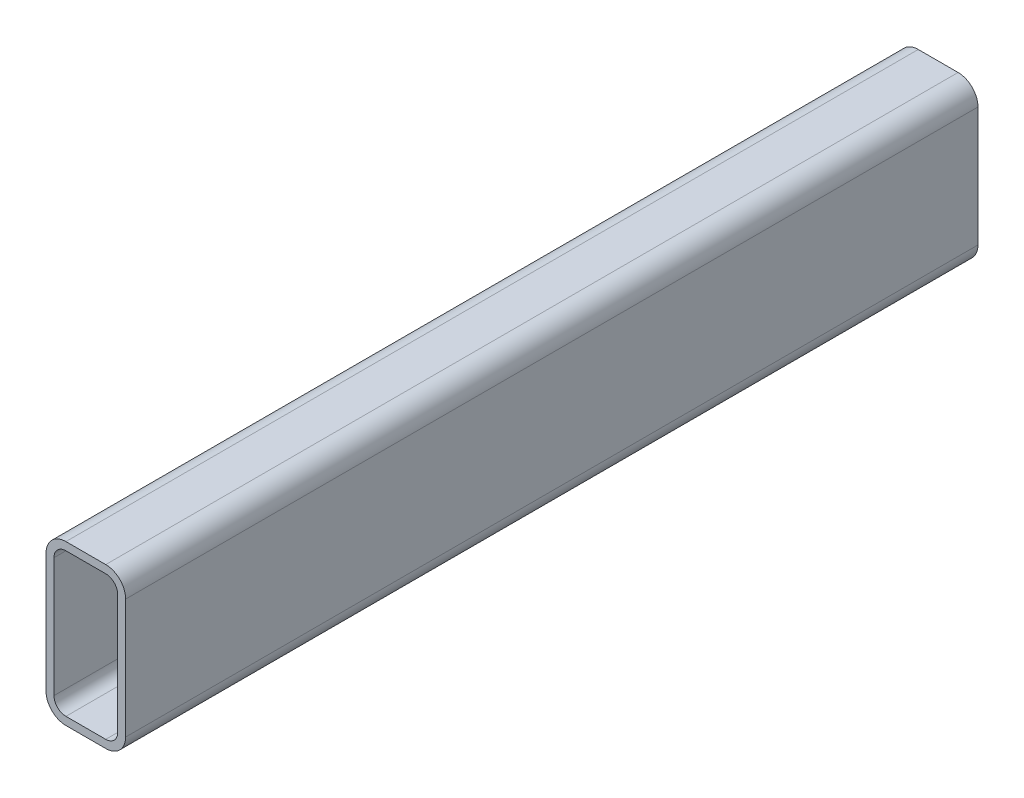
ISO-10303-21;
HEADER;
FILE_DESCRIPTION(('STEP AP214'),'2;1');
FILE_NAME('part.step','',(''),(''),'','','');
FILE_SCHEMA(('AUTOMOTIVE_DESIGN { 1 0 10303 214 1 1 1 1 }'));
ENDSEC;
DATA;
#1=APPLICATION_CONTEXT('core data for automotive mechanical design processes');
#2=APPLICATION_PROTOCOL_DEFINITION('international standard','automotive_design',2000,#1);
#3=PRODUCT_CONTEXT('',#1,'mechanical');
#4=PRODUCT('Part','Part','',(#3));
#5=PRODUCT_RELATED_PRODUCT_CATEGORY('part','',(#4));
#6=PRODUCT_DEFINITION_FORMATION('','',#4);
#7=PRODUCT_DEFINITION_CONTEXT('part definition',#1,'design');
#8=PRODUCT_DEFINITION('design','',#6,#7);
#9=PRODUCT_DEFINITION_SHAPE('','',#8);
#10=(LENGTH_UNIT() NAMED_UNIT(*) SI_UNIT(.MILLI.,.METRE.));
#11=(NAMED_UNIT(*) PLANE_ANGLE_UNIT() SI_UNIT($,.RADIAN.));
#12=(NAMED_UNIT(*) SI_UNIT($,.STERADIAN.) SOLID_ANGLE_UNIT());
#13=UNCERTAINTY_MEASURE_WITH_UNIT(LENGTH_MEASURE(1.E-05),#10,'distance_accuracy_value','');
#14=(GEOMETRIC_REPRESENTATION_CONTEXT(3) GLOBAL_UNCERTAINTY_ASSIGNED_CONTEXT((#13)) GLOBAL_UNIT_ASSIGNED_CONTEXT((#10,
#11,#12)) REPRESENTATION_CONTEXT('',''));
#15=CARTESIAN_POINT('',(0.,0.,0.));
#16=DIRECTION('',(0.,0.,1.));
#17=DIRECTION('',(1.,0.,0.));
#18=AXIS2_PLACEMENT_3D('',#15,#16,#17);
#19=CARTESIAN_POINT('',(-20.,-60.,428.));
#20=DIRECTION('',(0.,0.,1.));
#21=DIRECTION('',(1.,0.,0.));
#22=AXIS2_PLACEMENT_3D('',#19,#20,#21);
#23=PLANE('',#22);
#24=CARTESIAN_POINT('',(-20.,-60.,428.));
#25=DIRECTION('',(0.,0.,1.));
#26=DIRECTION('',(1.,0.,0.));
#27=AXIS2_PLACEMENT_3D('',#24,#25,#26);
#28=CIRCLE('',#27,20.);
#29=CARTESIAN_POINT('',(-40.,-60.,428.));
#30=VERTEX_POINT('',#29);
#31=CARTESIAN_POINT('',(-20.,-80.,428.));
#32=VERTEX_POINT('',#31);
#33=EDGE_CURVE('E212',#30,#32,#28,.T.);
#34=ORIENTED_EDGE('',*,*,#33,.T.);
#35=DIRECTION('',(1.,0.,0.));
#36=VECTOR('',#35,1.);
#37=CARTESIAN_POINT('',(-20.,-80.,428.));
#38=LINE('',#37,#36);
#39=CARTESIAN_POINT('',(20.,-80.,428.));
#40=VERTEX_POINT('',#39);
#41=EDGE_CURVE('E215',#32,#40,#38,.T.);
#42=ORIENTED_EDGE('',*,*,#41,.T.);
#43=CARTESIAN_POINT('',(20.,-60.,428.));
#44=DIRECTION('',(0.,0.,1.));
#45=DIRECTION('',(1.,0.,0.));
#46=AXIS2_PLACEMENT_3D('',#43,#44,#45);
#47=CIRCLE('',#46,20.);
#48=CARTESIAN_POINT('',(40.,-60.,428.));
#49=VERTEX_POINT('',#48);
#50=EDGE_CURVE('E218',#40,#49,#47,.T.);
#51=ORIENTED_EDGE('',*,*,#50,.T.);
#52=DIRECTION('',(0.,1.,0.));
#53=VECTOR('',#52,1.);
#54=CARTESIAN_POINT('',(40.,60.,428.));
#55=LINE('',#54,#53);
#56=CARTESIAN_POINT('',(40.,60.,428.));
#57=VERTEX_POINT('',#56);
#58=EDGE_CURVE('E220',#49,#57,#55,.T.);
#59=ORIENTED_EDGE('',*,*,#58,.T.);
#60=CARTESIAN_POINT('',(20.,60.,428.));
#61=DIRECTION('',(0.,0.,1.));
#62=DIRECTION('',(-1.,0.,0.));
#63=AXIS2_PLACEMENT_3D('',#60,#61,#62);
#64=CIRCLE('',#63,20.);
#65=CARTESIAN_POINT('',(20.,80.,428.));
#66=VERTEX_POINT('',#65);
#67=EDGE_CURVE('E222',#57,#66,#64,.T.);
#68=ORIENTED_EDGE('',*,*,#67,.T.);
#69=DIRECTION('',(-1.,0.,0.));
#70=VECTOR('',#69,1.);
#71=CARTESIAN_POINT('',(-20.,80.,428.));
#72=LINE('',#71,#70);
#73=CARTESIAN_POINT('',(-20.,80.,428.));
#74=VERTEX_POINT('',#73);
#75=EDGE_CURVE('E224',#66,#74,#72,.T.);
#76=ORIENTED_EDGE('',*,*,#75,.T.);
#77=CARTESIAN_POINT('',(-20.,60.,428.));
#78=DIRECTION('',(0.,0.,1.));
#79=DIRECTION('',(1.,0.,0.));
#80=AXIS2_PLACEMENT_3D('',#77,#78,#79);
#81=CIRCLE('',#80,20.);
#82=CARTESIAN_POINT('',(-40.,60.,428.));
#83=VERTEX_POINT('',#82);
#84=EDGE_CURVE('E226',#74,#83,#81,.T.);
#85=ORIENTED_EDGE('',*,*,#84,.T.);
#86=DIRECTION('',(0.,-1.,0.));
#87=VECTOR('',#86,1.);
#88=CARTESIAN_POINT('',(-40.,60.,428.));
#89=LINE('',#88,#87);
#90=EDGE_CURVE('E228',#83,#30,#89,.T.);
#91=ORIENTED_EDGE('',*,*,#90,.T.);
#92=EDGE_LOOP('',(#34,#42,#51,#59,#68,#76,#85,#91));
#93=FACE_BOUND('',#92,.T.);
#94=DIRECTION('',(1.,0.,0.));
#95=VECTOR('',#94,1.);
#96=CARTESIAN_POINT('',(-20.,-72.,428.));
#97=LINE('',#96,#95);
#98=CARTESIAN_POINT('',(-20.,-72.,428.));
#99=VERTEX_POINT('',#98);
#100=CARTESIAN_POINT('',(20.,-72.,428.));
#101=VERTEX_POINT('',#100);
#102=EDGE_CURVE('E155',#99,#101,#97,.T.);
#103=ORIENTED_EDGE('',*,*,#102,.F.);
#104=CARTESIAN_POINT('',(-20.,-60.,428.));
#105=DIRECTION('',(0.,0.,1.));
#106=DIRECTION('',(-1.,0.,0.));
#107=AXIS2_PLACEMENT_3D('',#104,#105,#106);
#108=CIRCLE('',#107,12.);
#109=CARTESIAN_POINT('',(-32.,-60.,428.));
#110=VERTEX_POINT('',#109);
#111=EDGE_CURVE('E147',#110,#99,#108,.T.);
#112=ORIENTED_EDGE('',*,*,#111,.F.);
#113=DIRECTION('',(0.,-1.,0.));
#114=VECTOR('',#113,1.);
#115=CARTESIAN_POINT('',(-32.,60.,428.));
#116=LINE('',#115,#114);
#117=CARTESIAN_POINT('',(-32.,60.,428.));
#118=VERTEX_POINT('',#117);
#119=EDGE_CURVE('E180',#118,#110,#116,.T.);
#120=ORIENTED_EDGE('',*,*,#119,.F.);
#121=CARTESIAN_POINT('',(-20.,60.,428.));
#122=DIRECTION('',(0.,0.,1.));
#123=DIRECTION('',(1.,0.,0.));
#124=AXIS2_PLACEMENT_3D('',#121,#122,#123);
#125=CIRCLE('',#124,12.);
#126=CARTESIAN_POINT('',(-20.,72.,428.));
#127=VERTEX_POINT('',#126);
#128=EDGE_CURVE('E178',#127,#118,#125,.T.);
#129=ORIENTED_EDGE('',*,*,#128,.F.);
#130=DIRECTION('',(-1.,0.,0.));
#131=VECTOR('',#130,1.);
#132=CARTESIAN_POINT('',(-20.,72.,428.));
#133=LINE('',#132,#131);
#134=CARTESIAN_POINT('',(20.,72.,428.));
#135=VERTEX_POINT('',#134);
#136=EDGE_CURVE('E176',#135,#127,#133,.T.);
#137=ORIENTED_EDGE('',*,*,#136,.F.);
#138=CARTESIAN_POINT('',(20.,60.,428.));
#139=DIRECTION('',(0.,0.,1.));
#140=DIRECTION('',(-1.,0.,0.));
#141=AXIS2_PLACEMENT_3D('',#138,#139,#140);
#142=CIRCLE('',#141,12.);
#143=CARTESIAN_POINT('',(32.,60.,428.));
#144=VERTEX_POINT('',#143);
#145=EDGE_CURVE('E174',#144,#135,#142,.T.);
#146=ORIENTED_EDGE('',*,*,#145,.F.);
#147=DIRECTION('',(0.,1.,0.));
#148=VECTOR('',#147,1.);
#149=CARTESIAN_POINT('',(32.,60.,428.));
#150=LINE('',#149,#148);
#151=CARTESIAN_POINT('',(32.,-60.,428.));
#152=VERTEX_POINT('',#151);
#153=EDGE_CURVE('E170',#152,#144,#150,.T.);
#154=ORIENTED_EDGE('',*,*,#153,.F.);
#155=CARTESIAN_POINT('',(20.,-60.,428.));
#156=DIRECTION('',(0.,0.,1.));
#157=DIRECTION('',(-1.,0.,0.));
#158=AXIS2_PLACEMENT_3D('',#155,#156,#157);
#159=CIRCLE('',#158,12.);
#160=EDGE_CURVE('E168',#101,#152,#159,.T.);
#161=ORIENTED_EDGE('',*,*,#160,.F.);
#162=EDGE_LOOP('',(#103,#112,#120,#129,#137,#146,#154,#161));
#163=FACE_BOUND('',#162,.T.);
#164=ADVANCED_FACE('F34',(#93,#163),#23,.T.);
#165=CARTESIAN_POINT('',(-20.,-60.,-428.));
#166=DIRECTION('',(0.,0.,1.));
#167=DIRECTION('',(1.,0.,0.));
#168=AXIS2_PLACEMENT_3D('',#165,#166,#167);
#169=PLANE('',#168);
#170=CARTESIAN_POINT('',(-20.,-60.,-428.));
#171=DIRECTION('',(0.,0.,1.));
#172=DIRECTION('',(1.,0.,0.));
#173=AXIS2_PLACEMENT_3D('',#170,#171,#172);
#174=CIRCLE('',#173,20.);
#175=CARTESIAN_POINT('',(-40.,-60.,-428.));
#176=VERTEX_POINT('',#175);
#177=CARTESIAN_POINT('',(-20.,-80.,-428.));
#178=VERTEX_POINT('',#177);
#179=EDGE_CURVE('E163',#176,#178,#174,.T.);
#180=ORIENTED_EDGE('',*,*,#179,.F.);
#181=DIRECTION('',(0.,-1.,0.));
#182=VECTOR('',#181,1.);
#183=CARTESIAN_POINT('',(-40.,60.,-428.));
#184=LINE('',#183,#182);
#185=CARTESIAN_POINT('',(-40.,60.,-428.));
#186=VERTEX_POINT('',#185);
#187=EDGE_CURVE('E216',#186,#176,#184,.T.);
#188=ORIENTED_EDGE('',*,*,#187,.F.);
#189=CARTESIAN_POINT('',(-20.,60.,-428.));
#190=DIRECTION('',(0.,0.,1.));
#191=DIRECTION('',(1.,0.,0.));
#192=AXIS2_PLACEMENT_3D('',#189,#190,#191);
#193=CIRCLE('',#192,20.);
#194=CARTESIAN_POINT('',(-20.,80.,-428.));
#195=VERTEX_POINT('',#194);
#196=EDGE_CURVE('E243',#195,#186,#193,.T.);
#197=ORIENTED_EDGE('',*,*,#196,.F.);
#198=DIRECTION('',(-1.,0.,0.));
#199=VECTOR('',#198,1.);
#200=CARTESIAN_POINT('',(-20.,80.,-428.));
#201=LINE('',#200,#199);
#202=CARTESIAN_POINT('',(20.,80.,-428.));
#203=VERTEX_POINT('',#202);
#204=EDGE_CURVE('E241',#203,#195,#201,.T.);
#205=ORIENTED_EDGE('',*,*,#204,.F.);
#206=CARTESIAN_POINT('',(20.,60.,-428.));
#207=DIRECTION('',(0.,0.,1.));
#208=DIRECTION('',(-1.,0.,0.));
#209=AXIS2_PLACEMENT_3D('',#206,#207,#208);
#210=CIRCLE('',#209,20.);
#211=CARTESIAN_POINT('',(40.,60.,-428.));
#212=VERTEX_POINT('',#211);
#213=EDGE_CURVE('E239',#212,#203,#210,.T.);
#214=ORIENTED_EDGE('',*,*,#213,.F.);
#215=DIRECTION('',(0.,1.,0.));
#216=VECTOR('',#215,1.);
#217=CARTESIAN_POINT('',(40.,60.,-428.));
#218=LINE('',#217,#216);
#219=CARTESIAN_POINT('',(40.,-60.,-428.));
#220=VERTEX_POINT('',#219);
#221=EDGE_CURVE('E237',#220,#212,#218,.T.);
#222=ORIENTED_EDGE('',*,*,#221,.F.);
#223=CARTESIAN_POINT('',(20.,-60.,-428.));
#224=DIRECTION('',(0.,0.,1.));
#225=DIRECTION('',(1.,0.,0.));
#226=AXIS2_PLACEMENT_3D('',#223,#224,#225);
#227=CIRCLE('',#226,20.);
#228=CARTESIAN_POINT('',(20.,-80.,-428.));
#229=VERTEX_POINT('',#228);
#230=EDGE_CURVE('E235',#229,#220,#227,.T.);
#231=ORIENTED_EDGE('',*,*,#230,.F.);
#232=DIRECTION('',(1.,0.,0.));
#233=VECTOR('',#232,1.);
#234=CARTESIAN_POINT('',(-20.,-80.,-428.));
#235=LINE('',#234,#233);
#236=EDGE_CURVE('E233',#178,#229,#235,.T.);
#237=ORIENTED_EDGE('',*,*,#236,.F.);
#238=EDGE_LOOP('',(#180,#188,#197,#205,#214,#222,#231,#237));
#239=FACE_BOUND('',#238,.T.);
#240=CARTESIAN_POINT('',(-20.,-60.,-428.));
#241=DIRECTION('',(0.,0.,1.));
#242=DIRECTION('',(-1.,0.,0.));
#243=AXIS2_PLACEMENT_3D('',#240,#241,#242);
#244=CIRCLE('',#243,12.);
#245=CARTESIAN_POINT('',(-32.,-60.,-428.));
#246=VERTEX_POINT('',#245);
#247=CARTESIAN_POINT('',(-20.,-72.,-428.));
#248=VERTEX_POINT('',#247);
#249=EDGE_CURVE('E57',#246,#248,#244,.T.);
#250=ORIENTED_EDGE('',*,*,#249,.T.);
#251=DIRECTION('',(1.,0.,0.));
#252=VECTOR('',#251,1.);
#253=CARTESIAN_POINT('',(-20.,-72.,-428.));
#254=LINE('',#253,#252);
#255=CARTESIAN_POINT('',(20.,-72.,-428.));
#256=VERTEX_POINT('',#255);
#257=EDGE_CURVE('E162',#248,#256,#254,.T.);
#258=ORIENTED_EDGE('',*,*,#257,.T.);
#259=CARTESIAN_POINT('',(20.,-60.,-428.));
#260=DIRECTION('',(0.,0.,1.));
#261=DIRECTION('',(-1.,0.,0.));
#262=AXIS2_PLACEMENT_3D('',#259,#260,#261);
#263=CIRCLE('',#262,12.);
#264=CARTESIAN_POINT('',(32.,-60.,-428.));
#265=VERTEX_POINT('',#264);
#266=EDGE_CURVE('E184',#256,#265,#263,.T.);
#267=ORIENTED_EDGE('',*,*,#266,.T.);
#268=DIRECTION('',(0.,1.,0.));
#269=VECTOR('',#268,1.);
#270=CARTESIAN_POINT('',(32.,60.,-428.));
#271=LINE('',#270,#269);
#272=CARTESIAN_POINT('',(32.,60.,-428.));
#273=VERTEX_POINT('',#272);
#274=EDGE_CURVE('E187',#265,#273,#271,.T.);
#275=ORIENTED_EDGE('',*,*,#274,.T.);
#276=CARTESIAN_POINT('',(20.,60.,-428.));
#277=DIRECTION('',(0.,0.,1.));
#278=DIRECTION('',(-1.,0.,0.));
#279=AXIS2_PLACEMENT_3D('',#276,#277,#278);
#280=CIRCLE('',#279,12.);
#281=CARTESIAN_POINT('',(20.,72.,-428.));
#282=VERTEX_POINT('',#281);
#283=EDGE_CURVE('E190',#273,#282,#280,.T.);
#284=ORIENTED_EDGE('',*,*,#283,.T.);
#285=DIRECTION('',(-1.,0.,0.));
#286=VECTOR('',#285,1.);
#287=CARTESIAN_POINT('',(-20.,72.,-428.));
#288=LINE('',#287,#286);
#289=CARTESIAN_POINT('',(-20.,72.,-428.));
#290=VERTEX_POINT('',#289);
#291=EDGE_CURVE('E193',#282,#290,#288,.T.);
#292=ORIENTED_EDGE('',*,*,#291,.T.);
#293=CARTESIAN_POINT('',(-20.,60.,-428.));
#294=DIRECTION('',(0.,0.,1.));
#295=DIRECTION('',(1.,0.,0.));
#296=AXIS2_PLACEMENT_3D('',#293,#294,#295);
#297=CIRCLE('',#296,12.);
#298=CARTESIAN_POINT('',(-32.,60.,-428.));
#299=VERTEX_POINT('',#298);
#300=EDGE_CURVE('E196',#290,#299,#297,.T.);
#301=ORIENTED_EDGE('',*,*,#300,.T.);
#302=DIRECTION('',(0.,-1.,0.));
#303=VECTOR('',#302,1.);
#304=CARTESIAN_POINT('',(-32.,60.,-428.));
#305=LINE('',#304,#303);
#306=EDGE_CURVE('E156',#299,#246,#305,.T.);
#307=ORIENTED_EDGE('',*,*,#306,.T.);
#308=EDGE_LOOP('',(#250,#258,#267,#275,#284,#292,#301,#307));
#309=FACE_BOUND('',#308,.T.);
#310=ADVANCED_FACE('F273',(#239,#309),#169,.F.);
#311=CARTESIAN_POINT('',(-20.,-60.,428.));
#312=DIRECTION('',(0.,0.,-1.));
#313=DIRECTION('',(-1.,0.,0.));
#314=AXIS2_PLACEMENT_3D('',#311,#312,#313);
#315=CYLINDRICAL_SURFACE('',#314,20.);
#316=ORIENTED_EDGE('',*,*,#179,.T.);
#317=DIRECTION('',(0.,0.,-1.));
#318=VECTOR('',#317,1.);
#319=CARTESIAN_POINT('',(-20.,-80.,428.));
#320=LINE('',#319,#318);
#321=EDGE_CURVE('E11',#32,#178,#320,.T.);
#322=ORIENTED_EDGE('',*,*,#321,.F.);
#323=ORIENTED_EDGE('',*,*,#33,.F.);
#324=DIRECTION('',(0.,0.,-1.));
#325=VECTOR('',#324,1.);
#326=CARTESIAN_POINT('',(-40.,-60.,428.));
#327=LINE('',#326,#325);
#328=EDGE_CURVE('E230',#30,#176,#327,.T.);
#329=ORIENTED_EDGE('',*,*,#328,.T.);
#330=EDGE_LOOP('',(#316,#322,#323,#329));
#331=FACE_BOUND('',#330,.T.);
#332=ADVANCED_FACE('F36',(#331),#315,.T.);
#333=CARTESIAN_POINT('',(-20.,-80.,428.));
#334=DIRECTION('',(0.,1.,0.));
#335=DIRECTION('',(0.,0.,1.));
#336=AXIS2_PLACEMENT_3D('',#333,#334,#335);
#337=PLANE('',#336);
#338=ORIENTED_EDGE('',*,*,#236,.T.);
#339=DIRECTION('',(0.,0.,-1.));
#340=VECTOR('',#339,1.);
#341=CARTESIAN_POINT('',(20.,-80.,428.));
#342=LINE('',#341,#340);
#343=EDGE_CURVE('E42',#40,#229,#342,.T.);
#344=ORIENTED_EDGE('',*,*,#343,.F.);
#345=ORIENTED_EDGE('',*,*,#41,.F.);
#346=ORIENTED_EDGE('',*,*,#321,.T.);
#347=EDGE_LOOP('',(#338,#344,#345,#346));
#348=FACE_BOUND('',#347,.T.);
#349=ADVANCED_FACE('F290',(#348),#337,.F.);
#350=CARTESIAN_POINT('',(20.,-60.,428.));
#351=DIRECTION('',(0.,0.,-1.));
#352=DIRECTION('',(-1.,0.,0.));
#353=AXIS2_PLACEMENT_3D('',#350,#351,#352);
#354=CYLINDRICAL_SURFACE('',#353,20.);
#355=ORIENTED_EDGE('',*,*,#230,.T.);
#356=DIRECTION('',(0.,0.,-1.));
#357=VECTOR('',#356,1.);
#358=CARTESIAN_POINT('',(40.,-60.,428.));
#359=LINE('',#358,#357);
#360=EDGE_CURVE('E260',#49,#220,#359,.T.);
#361=ORIENTED_EDGE('',*,*,#360,.F.);
#362=ORIENTED_EDGE('',*,*,#50,.F.);
#363=ORIENTED_EDGE('',*,*,#343,.T.);
#364=EDGE_LOOP('',(#355,#361,#362,#363));
#365=FACE_BOUND('',#364,.T.);
#366=ADVANCED_FACE('F267',(#365),#354,.T.);
#367=CARTESIAN_POINT('',(40.,60.,428.));
#368=DIRECTION('',(-1.,0.,0.));
#369=DIRECTION('',(0.,0.,1.));
#370=AXIS2_PLACEMENT_3D('',#367,#368,#369);
#371=PLANE('',#370);
#372=ORIENTED_EDGE('',*,*,#221,.T.);
#373=DIRECTION('',(0.,0.,-1.));
#374=VECTOR('',#373,1.);
#375=CARTESIAN_POINT('',(40.,60.,428.));
#376=LINE('',#375,#374);
#377=EDGE_CURVE('E257',#57,#212,#376,.T.);
#378=ORIENTED_EDGE('',*,*,#377,.F.);
#379=ORIENTED_EDGE('',*,*,#58,.F.);
#380=ORIENTED_EDGE('',*,*,#360,.T.);
#381=EDGE_LOOP('',(#372,#378,#379,#380));
#382=FACE_BOUND('',#381,.T.);
#383=ADVANCED_FACE('F279',(#382),#371,.F.);
#384=CARTESIAN_POINT('',(20.,60.,428.));
#385=DIRECTION('',(0.,0.,-1.));
#386=DIRECTION('',(-1.,0.,0.));
#387=AXIS2_PLACEMENT_3D('',#384,#385,#386);
#388=CYLINDRICAL_SURFACE('',#387,20.);
#389=ORIENTED_EDGE('',*,*,#213,.T.);
#390=DIRECTION('',(0.,0.,-1.));
#391=VECTOR('',#390,1.);
#392=CARTESIAN_POINT('',(20.,80.,428.));
#393=LINE('',#392,#391);
#394=EDGE_CURVE('E254',#66,#203,#393,.T.);
#395=ORIENTED_EDGE('',*,*,#394,.F.);
#396=ORIENTED_EDGE('',*,*,#67,.F.);
#397=ORIENTED_EDGE('',*,*,#377,.T.);
#398=EDGE_LOOP('',(#389,#395,#396,#397));
#399=FACE_BOUND('',#398,.T.);
#400=ADVANCED_FACE('F283',(#399),#388,.T.);
#401=CARTESIAN_POINT('',(-20.,80.,428.));
#402=DIRECTION('',(0.,-1.,0.));
#403=DIRECTION('',(0.,0.,-1.));
#404=AXIS2_PLACEMENT_3D('',#401,#402,#403);
#405=PLANE('',#404);
#406=ORIENTED_EDGE('',*,*,#204,.T.);
#407=DIRECTION('',(0.,0.,-1.));
#408=VECTOR('',#407,1.);
#409=CARTESIAN_POINT('',(-20.,80.,428.));
#410=LINE('',#409,#408);
#411=EDGE_CURVE('E251',#74,#195,#410,.T.);
#412=ORIENTED_EDGE('',*,*,#411,.F.);
#413=ORIENTED_EDGE('',*,*,#75,.F.);
#414=ORIENTED_EDGE('',*,*,#394,.T.);
#415=EDGE_LOOP('',(#406,#412,#413,#414));
#416=FACE_BOUND('',#415,.T.);
#417=ADVANCED_FACE('F303',(#416),#405,.F.);
#418=CARTESIAN_POINT('',(-20.,60.,428.));
#419=DIRECTION('',(0.,0.,-1.));
#420=DIRECTION('',(-1.,0.,0.));
#421=AXIS2_PLACEMENT_3D('',#418,#419,#420);
#422=CYLINDRICAL_SURFACE('',#421,20.);
#423=ORIENTED_EDGE('',*,*,#196,.T.);
#424=DIRECTION('',(0.,0.,-1.));
#425=VECTOR('',#424,1.);
#426=CARTESIAN_POINT('',(-40.,60.,428.));
#427=LINE('',#426,#425);
#428=EDGE_CURVE('E248',#83,#186,#427,.T.);
#429=ORIENTED_EDGE('',*,*,#428,.F.);
#430=ORIENTED_EDGE('',*,*,#84,.F.);
#431=ORIENTED_EDGE('',*,*,#411,.T.);
#432=EDGE_LOOP('',(#423,#429,#430,#431));
#433=FACE_BOUND('',#432,.T.);
#434=ADVANCED_FACE('F301',(#433),#422,.T.);
#435=CARTESIAN_POINT('',(-40.,60.,428.));
#436=DIRECTION('',(1.,0.,0.));
#437=DIRECTION('',(0.,1.,0.));
#438=AXIS2_PLACEMENT_3D('',#435,#436,#437);
#439=PLANE('',#438);
#440=ORIENTED_EDGE('',*,*,#187,.T.);
#441=ORIENTED_EDGE('',*,*,#328,.F.);
#442=ORIENTED_EDGE('',*,*,#90,.F.);
#443=ORIENTED_EDGE('',*,*,#428,.T.);
#444=EDGE_LOOP('',(#440,#441,#442,#443));
#445=FACE_BOUND('',#444,.T.);
#446=ADVANCED_FACE('F296',(#445),#439,.F.);
#447=CARTESIAN_POINT('',(-20.,-60.,428.));
#448=DIRECTION('',(0.,0.,-1.));
#449=DIRECTION('',(-1.,0.,0.));
#450=AXIS2_PLACEMENT_3D('',#447,#448,#449);
#451=CYLINDRICAL_SURFACE('',#450,12.);
#452=ORIENTED_EDGE('',*,*,#249,.F.);
#453=DIRECTION('',(0.,0.,-1.));
#454=VECTOR('',#453,1.);
#455=CARTESIAN_POINT('',(-32.,-60.,428.));
#456=LINE('',#455,#454);
#457=EDGE_CURVE('E151',#110,#246,#456,.T.);
#458=ORIENTED_EDGE('',*,*,#457,.F.);
#459=ORIENTED_EDGE('',*,*,#111,.T.);
#460=DIRECTION('',(0.,0.,-1.));
#461=VECTOR('',#460,1.);
#462=CARTESIAN_POINT('',(-20.,-72.,428.));
#463=LINE('',#462,#461);
#464=EDGE_CURVE('E150',#99,#248,#463,.T.);
#465=ORIENTED_EDGE('',*,*,#464,.T.);
#466=EDGE_LOOP('',(#452,#458,#459,#465));
#467=FACE_BOUND('',#466,.T.);
#468=ADVANCED_FACE('F149',(#467),#451,.F.);
#469=CARTESIAN_POINT('',(-20.,-72.,428.));
#470=DIRECTION('',(0.,1.,0.));
#471=DIRECTION('',(0.,0.,1.));
#472=AXIS2_PLACEMENT_3D('',#469,#470,#471);
#473=PLANE('',#472);
#474=ORIENTED_EDGE('',*,*,#257,.F.);
#475=ORIENTED_EDGE('',*,*,#464,.F.);
#476=ORIENTED_EDGE('',*,*,#102,.T.);
#477=DIRECTION('',(0.,0.,-1.));
#478=VECTOR('',#477,1.);
#479=CARTESIAN_POINT('',(20.,-72.,428.));
#480=LINE('',#479,#478);
#481=EDGE_CURVE('E164',#101,#256,#480,.T.);
#482=ORIENTED_EDGE('',*,*,#481,.T.);
#483=EDGE_LOOP('',(#474,#475,#476,#482));
#484=FACE_BOUND('',#483,.T.);
#485=ADVANCED_FACE('F159',(#484),#473,.T.);
#486=CARTESIAN_POINT('',(20.,-60.,428.));
#487=DIRECTION('',(0.,0.,-1.));
#488=DIRECTION('',(-1.,0.,0.));
#489=AXIS2_PLACEMENT_3D('',#486,#487,#488);
#490=CYLINDRICAL_SURFACE('',#489,12.);
#491=ORIENTED_EDGE('',*,*,#266,.F.);
#492=ORIENTED_EDGE('',*,*,#481,.F.);
#493=ORIENTED_EDGE('',*,*,#160,.T.);
#494=DIRECTION('',(0.,0.,-1.));
#495=VECTOR('',#494,1.);
#496=CARTESIAN_POINT('',(32.,-60.,428.));
#497=LINE('',#496,#495);
#498=EDGE_CURVE('E209',#152,#265,#497,.T.);
#499=ORIENTED_EDGE('',*,*,#498,.T.);
#500=EDGE_LOOP('',(#491,#492,#493,#499));
#501=FACE_BOUND('',#500,.T.);
#502=ADVANCED_FACE('F328',(#501),#490,.F.);
#503=CARTESIAN_POINT('',(32.,60.,428.));
#504=DIRECTION('',(-1.,0.,0.));
#505=DIRECTION('',(0.,0.,1.));
#506=AXIS2_PLACEMENT_3D('',#503,#504,#505);
#507=PLANE('',#506);
#508=ORIENTED_EDGE('',*,*,#274,.F.);
#509=ORIENTED_EDGE('',*,*,#498,.F.);
#510=ORIENTED_EDGE('',*,*,#153,.T.);
#511=DIRECTION('',(0.,0.,-1.));
#512=VECTOR('',#511,1.);
#513=CARTESIAN_POINT('',(32.,60.,428.));
#514=LINE('',#513,#512);
#515=EDGE_CURVE('E207',#144,#273,#514,.T.);
#516=ORIENTED_EDGE('',*,*,#515,.T.);
#517=EDGE_LOOP('',(#508,#509,#510,#516));
#518=FACE_BOUND('',#517,.T.);
#519=ADVANCED_FACE('F332',(#518),#507,.T.);
#520=CARTESIAN_POINT('',(20.,60.,428.));
#521=DIRECTION('',(0.,0.,-1.));
#522=DIRECTION('',(-1.,0.,0.));
#523=AXIS2_PLACEMENT_3D('',#520,#521,#522);
#524=CYLINDRICAL_SURFACE('',#523,12.);
#525=ORIENTED_EDGE('',*,*,#283,.F.);
#526=ORIENTED_EDGE('',*,*,#515,.F.);
#527=ORIENTED_EDGE('',*,*,#145,.T.);
#528=DIRECTION('',(0.,0.,-1.));
#529=VECTOR('',#528,1.);
#530=CARTESIAN_POINT('',(20.,72.,428.));
#531=LINE('',#530,#529);
#532=EDGE_CURVE('E205',#135,#282,#531,.T.);
#533=ORIENTED_EDGE('',*,*,#532,.T.);
#534=EDGE_LOOP('',(#525,#526,#527,#533));
#535=FACE_BOUND('',#534,.T.);
#536=ADVANCED_FACE('F338',(#535),#524,.F.);
#537=CARTESIAN_POINT('',(-20.,72.,428.));
#538=DIRECTION('',(0.,-1.,0.));
#539=DIRECTION('',(0.,0.,-1.));
#540=AXIS2_PLACEMENT_3D('',#537,#538,#539);
#541=PLANE('',#540);
#542=ORIENTED_EDGE('',*,*,#291,.F.);
#543=ORIENTED_EDGE('',*,*,#532,.F.);
#544=ORIENTED_EDGE('',*,*,#136,.T.);
#545=DIRECTION('',(0.,0.,-1.));
#546=VECTOR('',#545,1.);
#547=CARTESIAN_POINT('',(-20.,72.,428.));
#548=LINE('',#547,#546);
#549=EDGE_CURVE('E203',#127,#290,#548,.T.);
#550=ORIENTED_EDGE('',*,*,#549,.T.);
#551=EDGE_LOOP('',(#542,#543,#544,#550));
#552=FACE_BOUND('',#551,.T.);
#553=ADVANCED_FACE('F342',(#552),#541,.T.);
#554=CARTESIAN_POINT('',(-20.,60.,428.));
#555=DIRECTION('',(0.,0.,-1.));
#556=DIRECTION('',(-1.,0.,0.));
#557=AXIS2_PLACEMENT_3D('',#554,#555,#556);
#558=CYLINDRICAL_SURFACE('',#557,12.);
#559=ORIENTED_EDGE('',*,*,#300,.F.);
#560=ORIENTED_EDGE('',*,*,#549,.F.);
#561=ORIENTED_EDGE('',*,*,#128,.T.);
#562=DIRECTION('',(0.,0.,-1.));
#563=VECTOR('',#562,1.);
#564=CARTESIAN_POINT('',(-32.,60.,428.));
#565=LINE('',#564,#563);
#566=EDGE_CURVE('E49',#118,#299,#565,.T.);
#567=ORIENTED_EDGE('',*,*,#566,.T.);
#568=EDGE_LOOP('',(#559,#560,#561,#567));
#569=FACE_BOUND('',#568,.T.);
#570=ADVANCED_FACE('F346',(#569),#558,.F.);
#571=CARTESIAN_POINT('',(-32.,60.,428.));
#572=DIRECTION('',(1.,0.,0.));
#573=DIRECTION('',(0.,1.,0.));
#574=AXIS2_PLACEMENT_3D('',#571,#572,#573);
#575=PLANE('',#574);
#576=ORIENTED_EDGE('',*,*,#306,.F.);
#577=ORIENTED_EDGE('',*,*,#566,.F.);
#578=ORIENTED_EDGE('',*,*,#119,.T.);
#579=ORIENTED_EDGE('',*,*,#457,.T.);
#580=EDGE_LOOP('',(#576,#577,#578,#579));
#581=FACE_BOUND('',#580,.T.);
#582=ADVANCED_FACE('F350',(#581),#575,.T.);
#583=CLOSED_SHELL('',(#164,#310,#332,#349,#366,#383,#400,#417,#434,#446,#468,#485,#502,#519,
#536,#553,#570,#582));
#584=MANIFOLD_SOLID_BREP('B2',#583);
#585=ADVANCED_BREP_SHAPE_REPRESENTATION('',(#18,#584),#14);
#586=SHAPE_DEFINITION_REPRESENTATION(#9,#585);
ENDSEC;
END-ISO-10303-21;
